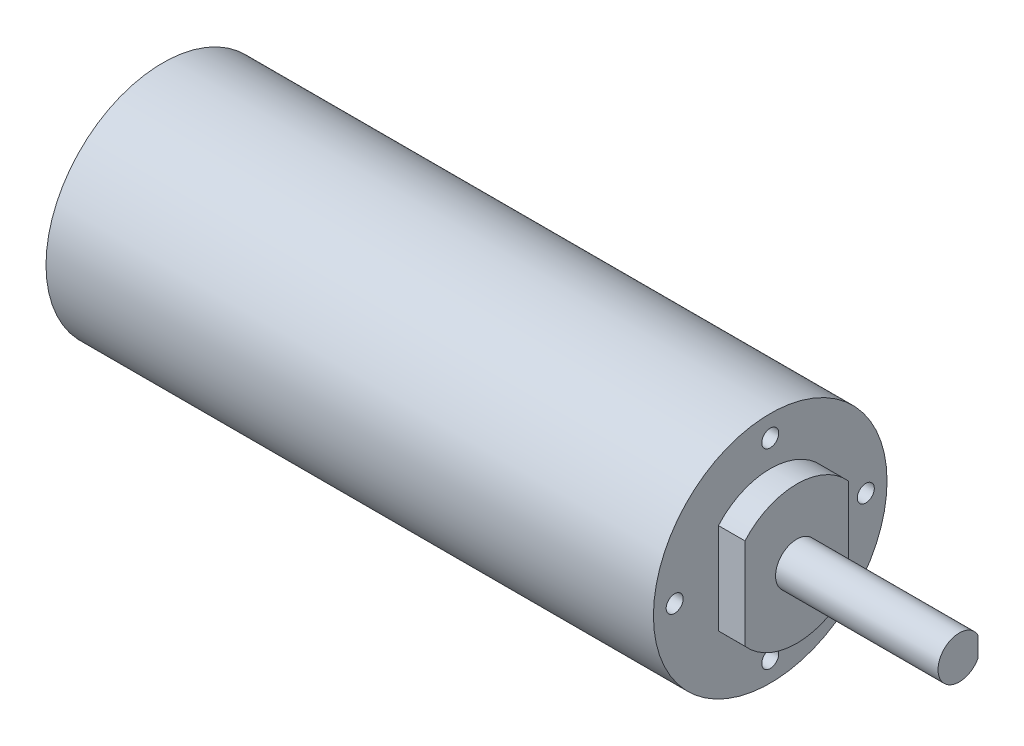
ISO-10303-21;
HEADER;
FILE_DESCRIPTION(('STEP AP214'),'2;1');
FILE_NAME('part.step','',(''),(''),'','','');
FILE_SCHEMA(('AUTOMOTIVE_DESIGN { 1 0 10303 214 1 1 1 1 }'));
ENDSEC;
DATA;
#1=APPLICATION_CONTEXT('core data for automotive mechanical design processes');
#2=APPLICATION_PROTOCOL_DEFINITION('international standard','automotive_design',2000,#1);
#3=PRODUCT_CONTEXT('',#1,'mechanical');
#4=PRODUCT('Part','Part','',(#3));
#5=PRODUCT_RELATED_PRODUCT_CATEGORY('part','',(#4));
#6=PRODUCT_DEFINITION_FORMATION('','',#4);
#7=PRODUCT_DEFINITION_CONTEXT('part definition',#1,'design');
#8=PRODUCT_DEFINITION('design','',#6,#7);
#9=PRODUCT_DEFINITION_SHAPE('','',#8);
#10=(LENGTH_UNIT() NAMED_UNIT(*) SI_UNIT(.MILLI.,.METRE.));
#11=(NAMED_UNIT(*) PLANE_ANGLE_UNIT() SI_UNIT($,.RADIAN.));
#12=(NAMED_UNIT(*) SI_UNIT($,.STERADIAN.) SOLID_ANGLE_UNIT());
#13=UNCERTAINTY_MEASURE_WITH_UNIT(LENGTH_MEASURE(1.E-05),#10,'distance_accuracy_value','');
#14=(GEOMETRIC_REPRESENTATION_CONTEXT(3) GLOBAL_UNCERTAINTY_ASSIGNED_CONTEXT((#13)) GLOBAL_UNIT_ASSIGNED_CONTEXT((#10,
#11,#12)) REPRESENTATION_CONTEXT('',''));
#15=CARTESIAN_POINT('',(0.,0.,0.));
#16=DIRECTION('',(0.,0.,1.));
#17=DIRECTION('',(1.,0.,0.));
#18=AXIS2_PLACEMENT_3D('',#15,#16,#17);
#19=CARTESIAN_POINT('',(59.7,0.,0.));
#20=DIRECTION('',(1.,0.,0.));
#21=DIRECTION('',(0.,0.,-1.));
#22=AXIS2_PLACEMENT_3D('',#19,#20,#21);
#23=PLANE('',#22);
#24=DIRECTION('',(0.,-1.,0.));
#25=VECTOR('',#24,1.);
#26=CARTESIAN_POINT('',(59.7,0.,-4.87756748138754));
#27=LINE('',#26,#25);
#28=CARTESIAN_POINT('',(59.7,4.29643287676077,-4.87756748138754));
#29=VERTEX_POINT('',#28);
#30=CARTESIAN_POINT('',(59.7,-4.29643287676077,-4.87756748138754));
#31=VERTEX_POINT('',#30);
#32=EDGE_CURVE('E138',#29,#31,#27,.T.);
#33=ORIENTED_EDGE('',*,*,#32,.F.);
#34=CARTESIAN_POINT('',(59.7,0.,0.));
#35=DIRECTION('',(1.,0.,0.));
#36=DIRECTION('',(0.,0.,-1.));
#37=AXIS2_PLACEMENT_3D('',#34,#35,#36);
#38=CIRCLE('',#37,6.5);
#39=CARTESIAN_POINT('',(59.7,4.29643287676077,4.87756748138754));
#40=VERTEX_POINT('',#39);
#41=EDGE_CURVE('E142',#29,#40,#38,.T.);
#42=ORIENTED_EDGE('',*,*,#41,.T.);
#43=DIRECTION('',(0.,-1.,0.));
#44=VECTOR('',#43,1.);
#45=CARTESIAN_POINT('',(59.7,0.,4.87756748138754));
#46=LINE('',#45,#44);
#47=CARTESIAN_POINT('',(59.7,-4.29643287676077,4.87756748138754));
#48=VERTEX_POINT('',#47);
#49=EDGE_CURVE('E146',#40,#48,#46,.T.);
#50=ORIENTED_EDGE('',*,*,#49,.T.);
#51=EDGE_CURVE('E147',#48,#31,#38,.T.);
#52=ORIENTED_EDGE('',*,*,#51,.T.);
#53=EDGE_LOOP('',(#33,#42,#50,#52));
#54=FACE_BOUND('',#53,.T.);
#55=CARTESIAN_POINT('',(59.7,0.,0.));
#56=DIRECTION('',(1.,0.,0.));
#57=DIRECTION('',(0.,0.,-1.));
#58=AXIS2_PLACEMENT_3D('',#55,#56,#57);
#59=CIRCLE('',#58,2.);
#60=CARTESIAN_POINT('',(59.7,0.940425446770166,-1.76510622316821));
#61=VERTEX_POINT('',#60);
#62=CARTESIAN_POINT('',(59.7,-0.940425446770166,-1.76510622316821));
#63=VERTEX_POINT('',#62);
#64=EDGE_CURVE('E60',#61,#63,#59,.T.);
#65=ORIENTED_EDGE('',*,*,#64,.F.);
#66=DIRECTION('',(0.,-1.,0.));
#67=VECTOR('',#66,1.);
#68=CARTESIAN_POINT('',(59.7,0.,-1.76510622316821));
#69=LINE('',#68,#67);
#70=EDGE_CURVE('E117',#61,#63,#69,.T.);
#71=ORIENTED_EDGE('',*,*,#70,.T.);
#72=EDGE_LOOP('',(#65,#71));
#73=FACE_BOUND('',#72,.T.);
#74=ADVANCED_FACE('F45',(#54,#73),#23,.T.);
#75=CARTESIAN_POINT('',(57.2,0.,0.));
#76=DIRECTION('',(1.,0.,0.));
#77=DIRECTION('',(0.,0.,-1.));
#78=AXIS2_PLACEMENT_3D('',#75,#76,#77);
#79=PLANE('',#78);
#80=CARTESIAN_POINT('',(57.2,0.,-9.));
#81=DIRECTION('',(1.,0.,0.));
#82=DIRECTION('',(0.,0.,-1.));
#83=AXIS2_PLACEMENT_3D('',#80,#81,#82);
#84=CIRCLE('',#83,0.799999999999999);
#85=CARTESIAN_POINT('',(57.2,0.,-9.8));
#86=VERTEX_POINT('',#85);
#87=EDGE_CURVE('E175',#86,#86,#84,.T.);
#88=ORIENTED_EDGE('',*,*,#87,.F.);
#89=EDGE_LOOP('',(#88));
#90=FACE_BOUND('',#89,.T.);
#91=CARTESIAN_POINT('',(57.2,9.,0.));
#92=DIRECTION('',(1.,0.,0.));
#93=DIRECTION('',(0.,0.,-1.));
#94=AXIS2_PLACEMENT_3D('',#91,#92,#93);
#95=CIRCLE('',#94,0.8);
#96=CARTESIAN_POINT('',(57.2,9.,-0.8));
#97=VERTEX_POINT('',#96);
#98=EDGE_CURVE('E183',#97,#97,#95,.T.);
#99=ORIENTED_EDGE('',*,*,#98,.F.);
#100=EDGE_LOOP('',(#99));
#101=FACE_BOUND('',#100,.T.);
#102=CARTESIAN_POINT('',(57.2,0.,9.));
#103=DIRECTION('',(1.,0.,0.));
#104=DIRECTION('',(0.,0.,-1.));
#105=AXIS2_PLACEMENT_3D('',#102,#103,#104);
#106=CIRCLE('',#105,0.799999999999999);
#107=CARTESIAN_POINT('',(57.2,0.,8.2));
#108=VERTEX_POINT('',#107);
#109=EDGE_CURVE('E191',#108,#108,#106,.T.);
#110=ORIENTED_EDGE('',*,*,#109,.F.);
#111=EDGE_LOOP('',(#110));
#112=FACE_BOUND('',#111,.T.);
#113=CARTESIAN_POINT('',(57.2,-9.,0.));
#114=DIRECTION('',(1.,0.,0.));
#115=DIRECTION('',(0.,0.,-1.));
#116=AXIS2_PLACEMENT_3D('',#113,#114,#115);
#117=CIRCLE('',#116,0.799999999999999);
#118=CARTESIAN_POINT('',(57.2,-9.,-0.799999999999999));
#119=VERTEX_POINT('',#118);
#120=EDGE_CURVE('E199',#119,#119,#117,.T.);
#121=ORIENTED_EDGE('',*,*,#120,.F.);
#122=EDGE_LOOP('',(#121));
#123=FACE_BOUND('',#122,.T.);
#124=CARTESIAN_POINT('',(57.2,0.,0.));
#125=DIRECTION('',(1.,0.,0.));
#126=DIRECTION('',(0.,0.,-1.));
#127=AXIS2_PLACEMENT_3D('',#124,#125,#126);
#128=CIRCLE('',#127,11.);
#129=CARTESIAN_POINT('',(57.2,0.,-11.));
#130=VERTEX_POINT('',#129);
#131=EDGE_CURVE('E11',#130,#130,#128,.T.);
#132=ORIENTED_EDGE('',*,*,#131,.T.);
#133=EDGE_LOOP('',(#132));
#134=FACE_BOUND('',#133,.T.);
#135=CARTESIAN_POINT('',(57.2,0.,0.));
#136=DIRECTION('',(1.,0.,0.));
#137=DIRECTION('',(0.,0.,-1.));
#138=AXIS2_PLACEMENT_3D('',#135,#136,#137);
#139=CIRCLE('',#138,6.5);
#140=CARTESIAN_POINT('',(57.2,4.29643287676077,-4.87756748138754));
#141=VERTEX_POINT('',#140);
#142=CARTESIAN_POINT('',(57.2,4.29643287676077,4.87756748138754));
#143=VERTEX_POINT('',#142);
#144=EDGE_CURVE('E152',#141,#143,#139,.T.);
#145=ORIENTED_EDGE('',*,*,#144,.F.);
#146=DIRECTION('',(0.,-1.,0.));
#147=VECTOR('',#146,1.);
#148=CARTESIAN_POINT('',(57.2,0.,-4.87756748138754));
#149=LINE('',#148,#147);
#150=CARTESIAN_POINT('',(57.2,-4.29643287676077,-4.87756748138754));
#151=VERTEX_POINT('',#150);
#152=EDGE_CURVE('E68',#141,#151,#149,.T.);
#153=ORIENTED_EDGE('',*,*,#152,.T.);
#154=CARTESIAN_POINT('',(57.2,-4.29643287676077,4.87756748138754));
#155=VERTEX_POINT('',#154);
#156=EDGE_CURVE('E143',#155,#151,#139,.T.);
#157=ORIENTED_EDGE('',*,*,#156,.F.);
#158=DIRECTION('',(0.,-1.,0.));
#159=VECTOR('',#158,1.);
#160=CARTESIAN_POINT('',(57.2,0.,4.87756748138754));
#161=LINE('',#160,#159);
#162=EDGE_CURVE('E156',#143,#155,#161,.T.);
#163=ORIENTED_EDGE('',*,*,#162,.F.);
#164=EDGE_LOOP('',(#145,#153,#157,#163));
#165=FACE_BOUND('',#164,.T.);
#166=ADVANCED_FACE('F223',(#90,#101,#112,#123,#134,#165),#79,.T.);
#167=CARTESIAN_POINT('',(57.2,0.,0.));
#168=DIRECTION('',(-1.,0.,0.));
#169=DIRECTION('',(0.,0.,1.));
#170=AXIS2_PLACEMENT_3D('',#167,#168,#169);
#171=CYLINDRICAL_SURFACE('',#170,11.);
#172=ORIENTED_EDGE('',*,*,#131,.F.);
#173=EDGE_LOOP('',(#172));
#174=FACE_BOUND('',#173,.T.);
#175=CARTESIAN_POINT('',(0.,0.,0.));
#176=DIRECTION('',(1.,0.,0.));
#177=DIRECTION('',(0.,0.,-1.));
#178=AXIS2_PLACEMENT_3D('',#175,#176,#177);
#179=CIRCLE('',#178,11.);
#180=CARTESIAN_POINT('',(0.,0.,-11.));
#181=VERTEX_POINT('',#180);
#182=EDGE_CURVE('E49',#181,#181,#179,.T.);
#183=ORIENTED_EDGE('',*,*,#182,.T.);
#184=EDGE_LOOP('',(#183));
#185=FACE_BOUND('',#184,.T.);
#186=ADVANCED_FACE('F47',(#174,#185),#171,.T.);
#187=CARTESIAN_POINT('',(0.,0.,0.));
#188=DIRECTION('',(1.,0.,0.));
#189=DIRECTION('',(0.,0.,-1.));
#190=AXIS2_PLACEMENT_3D('',#187,#188,#189);
#191=PLANE('',#190);
#192=ORIENTED_EDGE('',*,*,#182,.F.);
#193=EDGE_LOOP('',(#192));
#194=FACE_BOUND('',#193,.T.);
#195=ADVANCED_FACE('F213',(#194),#191,.F.);
#196=CARTESIAN_POINT('',(53.2,-9.,0.));
#197=DIRECTION('',(1.,0.,0.));
#198=DIRECTION('',(0.,0.,-1.));
#199=AXIS2_PLACEMENT_3D('',#196,#197,#198);
#200=CONICAL_SURFACE('',#199,0.799999999999999,1.02974425867666);
#201=CARTESIAN_POINT('',(52.719311504778,-9.,0.));
#202=VERTEX_POINT('',#201);
#203=VERTEX_LOOP('',#202);
#204=FACE_BOUND('',#203,.T.);
#205=CARTESIAN_POINT('',(53.2,-9.,0.));
#206=DIRECTION('',(1.,0.,0.));
#207=DIRECTION('',(0.,0.,-1.));
#208=AXIS2_PLACEMENT_3D('',#205,#206,#207);
#209=CIRCLE('',#208,0.799999999999999);
#210=CARTESIAN_POINT('',(53.2,-9.,-0.799999999999999));
#211=VERTEX_POINT('',#210);
#212=EDGE_CURVE('E203',#211,#211,#209,.T.);
#213=ORIENTED_EDGE('',*,*,#212,.T.);
#214=EDGE_LOOP('',(#213));
#215=FACE_BOUND('',#214,.T.);
#216=ADVANCED_FACE('F215',(#204,#215),#200,.F.);
#217=CARTESIAN_POINT('',(57.2,-9.,0.));
#218=DIRECTION('',(1.,0.,0.));
#219=DIRECTION('',(0.,0.,-1.));
#220=AXIS2_PLACEMENT_3D('',#217,#218,#219);
#221=CYLINDRICAL_SURFACE('',#220,0.799999999999999);
#222=ORIENTED_EDGE('',*,*,#212,.F.);
#223=EDGE_LOOP('',(#222));
#224=FACE_BOUND('',#223,.T.);
#225=ORIENTED_EDGE('',*,*,#120,.T.);
#226=EDGE_LOOP('',(#225));
#227=FACE_BOUND('',#226,.T.);
#228=ADVANCED_FACE('F220',(#224,#227),#221,.F.);
#229=CARTESIAN_POINT('',(53.2,0.,9.));
#230=DIRECTION('',(1.,0.,0.));
#231=DIRECTION('',(0.,0.,-1.));
#232=AXIS2_PLACEMENT_3D('',#229,#230,#231);
#233=CONICAL_SURFACE('',#232,0.799999999999999,1.02974425867666);
#234=CARTESIAN_POINT('',(52.719311504778,0.,9.));
#235=VERTEX_POINT('',#234);
#236=VERTEX_LOOP('',#235);
#237=FACE_BOUND('',#236,.T.);
#238=CARTESIAN_POINT('',(53.2,0.,9.));
#239=DIRECTION('',(1.,0.,0.));
#240=DIRECTION('',(0.,0.,-1.));
#241=AXIS2_PLACEMENT_3D('',#238,#239,#240);
#242=CIRCLE('',#241,0.799999999999999);
#243=CARTESIAN_POINT('',(53.2,0.,8.2));
#244=VERTEX_POINT('',#243);
#245=EDGE_CURVE('E195',#244,#244,#242,.T.);
#246=ORIENTED_EDGE('',*,*,#245,.T.);
#247=EDGE_LOOP('',(#246));
#248=FACE_BOUND('',#247,.T.);
#249=ADVANCED_FACE('F270',(#237,#248),#233,.F.);
#250=CARTESIAN_POINT('',(57.2,0.,9.));
#251=DIRECTION('',(1.,0.,0.));
#252=DIRECTION('',(0.,0.,-1.));
#253=AXIS2_PLACEMENT_3D('',#250,#251,#252);
#254=CYLINDRICAL_SURFACE('',#253,0.799999999999999);
#255=ORIENTED_EDGE('',*,*,#245,.F.);
#256=EDGE_LOOP('',(#255));
#257=FACE_BOUND('',#256,.T.);
#258=ORIENTED_EDGE('',*,*,#109,.T.);
#259=EDGE_LOOP('',(#258));
#260=FACE_BOUND('',#259,.T.);
#261=ADVANCED_FACE('F266',(#257,#260),#254,.F.);
#262=CARTESIAN_POINT('',(53.2,9.,0.));
#263=DIRECTION('',(1.,0.,0.));
#264=DIRECTION('',(0.,0.,-1.));
#265=AXIS2_PLACEMENT_3D('',#262,#263,#264);
#266=CONICAL_SURFACE('',#265,0.799999999999999,1.02974425867666);
#267=CARTESIAN_POINT('',(52.719311504778,9.,0.));
#268=VERTEX_POINT('',#267);
#269=VERTEX_LOOP('',#268);
#270=FACE_BOUND('',#269,.T.);
#271=CARTESIAN_POINT('',(53.2,9.,0.));
#272=DIRECTION('',(1.,0.,0.));
#273=DIRECTION('',(0.,0.,-1.));
#274=AXIS2_PLACEMENT_3D('',#271,#272,#273);
#275=CIRCLE('',#274,0.799999999999999);
#276=CARTESIAN_POINT('',(53.2,9.,-0.799999999999999));
#277=VERTEX_POINT('',#276);
#278=EDGE_CURVE('E187',#277,#277,#275,.T.);
#279=ORIENTED_EDGE('',*,*,#278,.T.);
#280=EDGE_LOOP('',(#279));
#281=FACE_BOUND('',#280,.T.);
#282=ADVANCED_FACE('F262',(#270,#281),#266,.F.);
#283=CARTESIAN_POINT('',(57.2,9.,0.));
#284=DIRECTION('',(1.,0.,0.));
#285=DIRECTION('',(0.,0.,-1.));
#286=AXIS2_PLACEMENT_3D('',#283,#284,#285);
#287=CYLINDRICAL_SURFACE('',#286,0.799999999999999);
#288=ORIENTED_EDGE('',*,*,#278,.F.);
#289=EDGE_LOOP('',(#288));
#290=FACE_BOUND('',#289,.T.);
#291=ORIENTED_EDGE('',*,*,#98,.T.);
#292=EDGE_LOOP('',(#291));
#293=FACE_BOUND('',#292,.T.);
#294=ADVANCED_FACE('F258',(#290,#293),#287,.F.);
#295=CARTESIAN_POINT('',(53.2,0.,-9.));
#296=DIRECTION('',(1.,0.,0.));
#297=DIRECTION('',(0.,0.,-1.));
#298=AXIS2_PLACEMENT_3D('',#295,#296,#297);
#299=CONICAL_SURFACE('',#298,0.799999999999999,1.02974425867666);
#300=CARTESIAN_POINT('',(52.719311504778,0.,-9.));
#301=VERTEX_POINT('',#300);
#302=VERTEX_LOOP('',#301);
#303=FACE_BOUND('',#302,.T.);
#304=CARTESIAN_POINT('',(53.2,0.,-9.));
#305=DIRECTION('',(1.,0.,0.));
#306=DIRECTION('',(0.,0.,-1.));
#307=AXIS2_PLACEMENT_3D('',#304,#305,#306);
#308=CIRCLE('',#307,0.799999999999999);
#309=CARTESIAN_POINT('',(53.2,0.,-9.8));
#310=VERTEX_POINT('',#309);
#311=EDGE_CURVE('E179',#310,#310,#308,.T.);
#312=ORIENTED_EDGE('',*,*,#311,.T.);
#313=EDGE_LOOP('',(#312));
#314=FACE_BOUND('',#313,.T.);
#315=ADVANCED_FACE('F254',(#303,#314),#299,.F.);
#316=CARTESIAN_POINT('',(57.2,0.,-9.));
#317=DIRECTION('',(1.,0.,0.));
#318=DIRECTION('',(0.,0.,-1.));
#319=AXIS2_PLACEMENT_3D('',#316,#317,#318);
#320=CYLINDRICAL_SURFACE('',#319,0.799999999999999);
#321=ORIENTED_EDGE('',*,*,#311,.F.);
#322=EDGE_LOOP('',(#321));
#323=FACE_BOUND('',#322,.T.);
#324=ORIENTED_EDGE('',*,*,#87,.T.);
#325=EDGE_LOOP('',(#324));
#326=FACE_BOUND('',#325,.T.);
#327=ADVANCED_FACE('F250',(#323,#326),#320,.F.);
#328=CARTESIAN_POINT('',(59.7,0.,-4.87756748138754));
#329=DIRECTION('',(0.,0.,-1.));
#330=DIRECTION('',(-1.,0.,0.));
#331=AXIS2_PLACEMENT_3D('',#328,#329,#330);
#332=PLANE('',#331);
#333=ORIENTED_EDGE('',*,*,#152,.F.);
#334=DIRECTION('',(-1.,0.,0.));
#335=VECTOR('',#334,1.);
#336=CARTESIAN_POINT('',(59.7,4.29643287676077,-4.87756748138754));
#337=LINE('',#336,#335);
#338=EDGE_CURVE('E171',#29,#141,#337,.T.);
#339=ORIENTED_EDGE('',*,*,#338,.F.);
#340=ORIENTED_EDGE('',*,*,#32,.T.);
#341=DIRECTION('',(-1.,0.,0.));
#342=VECTOR('',#341,1.);
#343=CARTESIAN_POINT('',(59.7,-4.29643287676077,-4.87756748138754));
#344=LINE('',#343,#342);
#345=EDGE_CURVE('E160',#31,#151,#344,.T.);
#346=ORIENTED_EDGE('',*,*,#345,.T.);
#347=EDGE_LOOP('',(#333,#339,#340,#346));
#348=FACE_BOUND('',#347,.T.);
#349=ADVANCED_FACE('F247',(#348),#332,.T.);
#350=CARTESIAN_POINT('',(59.7,0.,0.));
#351=DIRECTION('',(-1.,0.,0.));
#352=DIRECTION('',(0.,0.,1.));
#353=AXIS2_PLACEMENT_3D('',#350,#351,#352);
#354=CYLINDRICAL_SURFACE('',#353,6.5);
#355=ORIENTED_EDGE('',*,*,#144,.T.);
#356=DIRECTION('',(-1.,0.,0.));
#357=VECTOR('',#356,1.);
#358=CARTESIAN_POINT('',(59.7,4.29643287676077,4.87756748138754));
#359=LINE('',#358,#357);
#360=EDGE_CURVE('E167',#40,#143,#359,.T.);
#361=ORIENTED_EDGE('',*,*,#360,.F.);
#362=ORIENTED_EDGE('',*,*,#41,.F.);
#363=ORIENTED_EDGE('',*,*,#338,.T.);
#364=EDGE_LOOP('',(#355,#361,#362,#363));
#365=FACE_BOUND('',#364,.T.);
#366=ADVANCED_FACE('F243',(#365),#354,.T.);
#367=CARTESIAN_POINT('',(59.7,0.,4.87756748138754));
#368=DIRECTION('',(0.,0.,-1.));
#369=DIRECTION('',(-1.,0.,0.));
#370=AXIS2_PLACEMENT_3D('',#367,#368,#369);
#371=PLANE('',#370);
#372=ORIENTED_EDGE('',*,*,#162,.T.);
#373=DIRECTION('',(-1.,0.,0.));
#374=VECTOR('',#373,1.);
#375=CARTESIAN_POINT('',(59.7,-4.29643287676077,4.87756748138754));
#376=LINE('',#375,#374);
#377=EDGE_CURVE('E163',#48,#155,#376,.T.);
#378=ORIENTED_EDGE('',*,*,#377,.F.);
#379=ORIENTED_EDGE('',*,*,#49,.F.);
#380=ORIENTED_EDGE('',*,*,#360,.T.);
#381=EDGE_LOOP('',(#372,#378,#379,#380));
#382=FACE_BOUND('',#381,.T.);
#383=ADVANCED_FACE('F241',(#382),#371,.F.);
#384=ORIENTED_EDGE('',*,*,#156,.T.);
#385=ORIENTED_EDGE('',*,*,#345,.F.);
#386=ORIENTED_EDGE('',*,*,#51,.F.);
#387=ORIENTED_EDGE('',*,*,#377,.T.);
#388=EDGE_LOOP('',(#384,#385,#386,#387));
#389=FACE_BOUND('',#388,.T.);
#390=ADVANCED_FACE('F239',(#389),#354,.T.);
#391=CARTESIAN_POINT('',(75.,0.,-1.76510622316821));
#392=DIRECTION('',(0.,0.,-1.));
#393=DIRECTION('',(-1.,0.,0.));
#394=AXIS2_PLACEMENT_3D('',#391,#392,#393);
#395=PLANE('',#394);
#396=ORIENTED_EDGE('',*,*,#70,.F.);
#397=DIRECTION('',(-1.,0.,0.));
#398=VECTOR('',#397,1.);
#399=CARTESIAN_POINT('',(75.,0.940425446770166,-1.76510622316821));
#400=LINE('',#399,#398);
#401=CARTESIAN_POINT('',(75.,0.940425446770166,-1.76510622316821));
#402=VERTEX_POINT('',#401);
#403=EDGE_CURVE('E111',#402,#61,#400,.T.);
#404=ORIENTED_EDGE('',*,*,#403,.F.);
#405=DIRECTION('',(0.,-1.,0.));
#406=VECTOR('',#405,1.);
#407=CARTESIAN_POINT('',(75.,0.,-1.76510622316821));
#408=LINE('',#407,#406);
#409=CARTESIAN_POINT('',(75.,-0.940425446770166,-1.76510622316821));
#410=VERTEX_POINT('',#409);
#411=EDGE_CURVE('E116',#402,#410,#408,.T.);
#412=ORIENTED_EDGE('',*,*,#411,.T.);
#413=DIRECTION('',(-1.,0.,0.));
#414=VECTOR('',#413,1.);
#415=CARTESIAN_POINT('',(75.,-0.940425446770166,-1.76510622316821));
#416=LINE('',#415,#414);
#417=EDGE_CURVE('E120',#410,#63,#416,.T.);
#418=ORIENTED_EDGE('',*,*,#417,.T.);
#419=EDGE_LOOP('',(#396,#404,#412,#418));
#420=FACE_BOUND('',#419,.T.);
#421=ADVANCED_FACE('F113',(#420),#395,.T.);
#422=CARTESIAN_POINT('',(75.,0.,0.));
#423=DIRECTION('',(-1.,0.,0.));
#424=DIRECTION('',(0.,0.,1.));
#425=AXIS2_PLACEMENT_3D('',#422,#423,#424);
#426=CYLINDRICAL_SURFACE('',#425,2.);
#427=ORIENTED_EDGE('',*,*,#64,.T.);
#428=ORIENTED_EDGE('',*,*,#417,.F.);
#429=CARTESIAN_POINT('',(75.,0.,0.));
#430=DIRECTION('',(1.,0.,0.));
#431=DIRECTION('',(0.,0.,-1.));
#432=AXIS2_PLACEMENT_3D('',#429,#430,#431);
#433=CIRCLE('',#432,2.);
#434=EDGE_CURVE('E123',#402,#410,#433,.T.);
#435=ORIENTED_EDGE('',*,*,#434,.F.);
#436=ORIENTED_EDGE('',*,*,#403,.T.);
#437=EDGE_LOOP('',(#427,#428,#435,#436));
#438=FACE_BOUND('',#437,.T.);
#439=ADVANCED_FACE('F124',(#438),#426,.T.);
#440=CARTESIAN_POINT('',(75.,0.,0.));
#441=DIRECTION('',(1.,0.,0.));
#442=DIRECTION('',(0.,0.,-1.));
#443=AXIS2_PLACEMENT_3D('',#440,#441,#442);
#444=PLANE('',#443);
#445=ORIENTED_EDGE('',*,*,#411,.F.);
#446=ORIENTED_EDGE('',*,*,#434,.T.);
#447=EDGE_LOOP('',(#445,#446));
#448=FACE_BOUND('',#447,.T.);
#449=ADVANCED_FACE('F128',(#448),#444,.T.);
#450=CLOSED_SHELL('',(#74,#166,#186,#195,#216,#228,#249,#261,#282,#294,#315,#327,#349,#366,#383,
#390,#421,#439,#449));
#451=MANIFOLD_SOLID_BREP('B2',#450);
#452=ADVANCED_BREP_SHAPE_REPRESENTATION('',(#18,#451),#14);
#453=SHAPE_DEFINITION_REPRESENTATION(#9,#452);
ENDSEC;
END-ISO-10303-21;
